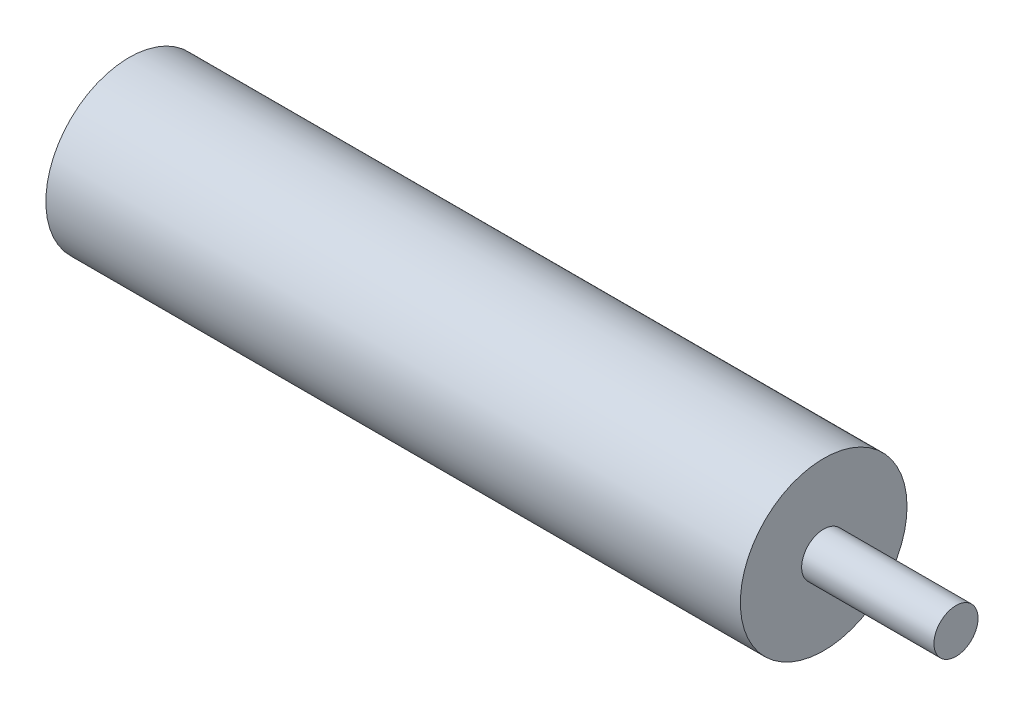
ISO-10303-21;
HEADER;
FILE_DESCRIPTION(('STEP AP214'),'2;1');
FILE_NAME('part.step','',(''),(''),'','','');
FILE_SCHEMA(('AUTOMOTIVE_DESIGN { 1 0 10303 214 1 1 1 1 }'));
ENDSEC;
DATA;
#1=APPLICATION_CONTEXT('core data for automotive mechanical design processes');
#2=APPLICATION_PROTOCOL_DEFINITION('international standard','automotive_design',2000,#1);
#3=PRODUCT_CONTEXT('',#1,'mechanical');
#4=PRODUCT('Part','Part','',(#3));
#5=PRODUCT_RELATED_PRODUCT_CATEGORY('part','',(#4));
#6=PRODUCT_DEFINITION_FORMATION('','',#4);
#7=PRODUCT_DEFINITION_CONTEXT('part definition',#1,'design');
#8=PRODUCT_DEFINITION('design','',#6,#7);
#9=PRODUCT_DEFINITION_SHAPE('','',#8);
#10=(LENGTH_UNIT() NAMED_UNIT(*) SI_UNIT(.MILLI.,.METRE.));
#11=(NAMED_UNIT(*) PLANE_ANGLE_UNIT() SI_UNIT($,.RADIAN.));
#12=(NAMED_UNIT(*) SI_UNIT($,.STERADIAN.) SOLID_ANGLE_UNIT());
#13=UNCERTAINTY_MEASURE_WITH_UNIT(LENGTH_MEASURE(1.E-05),#10,'distance_accuracy_value','');
#14=(GEOMETRIC_REPRESENTATION_CONTEXT(3) GLOBAL_UNCERTAINTY_ASSIGNED_CONTEXT((#13)) GLOBAL_UNIT_ASSIGNED_CONTEXT((#10,
#11,#12)) REPRESENTATION_CONTEXT('',''));
#15=CARTESIAN_POINT('',(0.,0.,0.));
#16=DIRECTION('',(0.,0.,1.));
#17=DIRECTION('',(1.,0.,0.));
#18=AXIS2_PLACEMENT_3D('',#15,#16,#17);
#19=CARTESIAN_POINT('',(50.,0.,0.));
#20=DIRECTION('',(-1.,0.,0.));
#21=DIRECTION('',(0.,0.,1.));
#22=AXIS2_PLACEMENT_3D('',#19,#20,#21);
#23=CYLINDRICAL_SURFACE('',#22,6.);
#24=CARTESIAN_POINT('',(50.,0.,0.));
#25=DIRECTION('',(1.,0.,0.));
#26=DIRECTION('',(0.,0.,-1.));
#27=AXIS2_PLACEMENT_3D('',#24,#25,#26);
#28=CIRCLE('',#27,6.);
#29=CARTESIAN_POINT('',(50.,0.,-6.));
#30=VERTEX_POINT('',#29);
#31=EDGE_CURVE('E37',#30,#30,#28,.T.);
#32=ORIENTED_EDGE('',*,*,#31,.F.);
#33=EDGE_LOOP('',(#32));
#34=FACE_BOUND('',#33,.T.);
#35=CARTESIAN_POINT('',(0.,0.,0.));
#36=DIRECTION('',(1.,0.,0.));
#37=DIRECTION('',(0.,0.,-1.));
#38=AXIS2_PLACEMENT_3D('',#35,#36,#37);
#39=CIRCLE('',#38,6.);
#40=CARTESIAN_POINT('',(0.,0.,-6.));
#41=VERTEX_POINT('',#40);
#42=EDGE_CURVE('E33',#41,#41,#39,.T.);
#43=ORIENTED_EDGE('',*,*,#42,.T.);
#44=EDGE_LOOP('',(#43));
#45=FACE_BOUND('',#44,.T.);
#46=ADVANCED_FACE('F30',(#34,#45),#23,.T.);
#47=CARTESIAN_POINT('',(50.,0.,0.));
#48=DIRECTION('',(1.,0.,0.));
#49=DIRECTION('',(0.,0.,-1.));
#50=AXIS2_PLACEMENT_3D('',#47,#48,#49);
#51=PLANE('',#50);
#52=CARTESIAN_POINT('',(50.,0.,0.));
#53=DIRECTION('',(1.,0.,0.));
#54=DIRECTION('',(0.,0.,-1.));
#55=AXIS2_PLACEMENT_3D('',#52,#53,#54);
#56=CIRCLE('',#55,1.5875);
#57=CARTESIAN_POINT('',(50.,0.,1.5875));
#58=VERTEX_POINT('',#57);
#59=EDGE_CURVE('E10',#58,#58,#56,.T.);
#60=ORIENTED_EDGE('',*,*,#59,.F.);
#61=EDGE_LOOP('',(#60));
#62=FACE_BOUND('',#61,.T.);
#63=ORIENTED_EDGE('',*,*,#31,.T.);
#64=EDGE_LOOP('',(#63));
#65=FACE_BOUND('',#64,.T.);
#66=ADVANCED_FACE('F54',(#62,#65),#51,.T.);
#67=CARTESIAN_POINT('',(0.,0.,0.));
#68=DIRECTION('',(1.,0.,0.));
#69=DIRECTION('',(0.,0.,-1.));
#70=AXIS2_PLACEMENT_3D('',#67,#68,#69);
#71=PLANE('',#70);
#72=ORIENTED_EDGE('',*,*,#42,.F.);
#73=EDGE_LOOP('',(#72));
#74=FACE_BOUND('',#73,.T.);
#75=ADVANCED_FACE('F51',(#74),#71,.F.);
#76=CARTESIAN_POINT('',(59.525,0.,0.));
#77=DIRECTION('',(-1.,0.,0.));
#78=DIRECTION('',(0.,0.,1.));
#79=AXIS2_PLACEMENT_3D('',#76,#77,#78);
#80=CYLINDRICAL_SURFACE('',#79,1.5875);
#81=CARTESIAN_POINT('',(59.525,0.,0.));
#82=DIRECTION('',(1.,0.,0.));
#83=DIRECTION('',(0.,0.,-1.));
#84=AXIS2_PLACEMENT_3D('',#81,#82,#83);
#85=CIRCLE('',#84,1.5875);
#86=CARTESIAN_POINT('',(59.525,0.,1.5875));
#87=VERTEX_POINT('',#86);
#88=EDGE_CURVE('E43',#87,#87,#85,.T.);
#89=CARTESIAN_POINT('',(59.525,0.,1.5875));
#90=CARTESIAN_POINT('',(59.42578125,0.,1.5875));
#91=CARTESIAN_POINT('',(59.3265625,0.,1.5875));
#92=CARTESIAN_POINT('',(59.128125,0.,1.5875));
#93=CARTESIAN_POINT('',(59.02890625,0.,1.5875));
#94=CARTESIAN_POINT('',(58.83046875,0.,1.5875));
#95=CARTESIAN_POINT('',(58.73125,0.,1.5875));
#96=CARTESIAN_POINT('',(58.5328125,0.,1.5875));
#97=CARTESIAN_POINT('',(58.43359375,0.,1.5875));
#98=CARTESIAN_POINT('',(58.23515625,0.,1.5875));
#99=CARTESIAN_POINT('',(58.1359375,0.,1.5875));
#100=CARTESIAN_POINT('',(57.9375,0.,1.5875));
#101=CARTESIAN_POINT('',(57.83828125,0.,1.5875));
#102=CARTESIAN_POINT('',(57.63984375,0.,1.5875));
#103=CARTESIAN_POINT('',(57.540625,0.,1.5875));
#104=CARTESIAN_POINT('',(57.3421875,0.,1.5875));
#105=CARTESIAN_POINT('',(57.24296875,0.,1.5875));
#106=CARTESIAN_POINT('',(57.04453125,0.,1.5875));
#107=CARTESIAN_POINT('',(56.9453125,0.,1.5875));
#108=CARTESIAN_POINT('',(56.746875,0.,1.5875));
#109=CARTESIAN_POINT('',(56.64765625,0.,1.5875));
#110=CARTESIAN_POINT('',(56.44921875,0.,1.5875));
#111=CARTESIAN_POINT('',(56.35,0.,1.5875));
#112=CARTESIAN_POINT('',(56.1515625,0.,1.5875));
#113=CARTESIAN_POINT('',(56.05234375,0.,1.5875));
#114=CARTESIAN_POINT('',(55.85390625,0.,1.5875));
#115=CARTESIAN_POINT('',(55.7546875,0.,1.5875));
#116=CARTESIAN_POINT('',(55.55625,0.,1.5875));
#117=CARTESIAN_POINT('',(55.45703125,0.,1.5875));
#118=CARTESIAN_POINT('',(55.25859375,0.,1.5875));
#119=CARTESIAN_POINT('',(55.159375,0.,1.5875));
#120=CARTESIAN_POINT('',(54.9609375,0.,1.5875));
#121=CARTESIAN_POINT('',(54.86171875,0.,1.5875));
#122=CARTESIAN_POINT('',(54.66328125,0.,1.5875));
#123=CARTESIAN_POINT('',(54.5640625,0.,1.5875));
#124=CARTESIAN_POINT('',(54.365625,0.,1.5875));
#125=CARTESIAN_POINT('',(54.26640625,0.,1.5875));
#126=CARTESIAN_POINT('',(54.06796875,0.,1.5875));
#127=CARTESIAN_POINT('',(53.96875,0.,1.5875));
#128=CARTESIAN_POINT('',(53.7703125,0.,1.5875));
#129=CARTESIAN_POINT('',(53.67109375,0.,1.5875));
#130=CARTESIAN_POINT('',(53.47265625,0.,1.5875));
#131=CARTESIAN_POINT('',(53.3734375,0.,1.5875));
#132=CARTESIAN_POINT('',(53.175,0.,1.5875));
#133=CARTESIAN_POINT('',(53.07578125,0.,1.5875));
#134=CARTESIAN_POINT('',(52.87734375,0.,1.5875));
#135=CARTESIAN_POINT('',(52.778125,0.,1.5875));
#136=CARTESIAN_POINT('',(52.5796875,0.,1.5875));
#137=CARTESIAN_POINT('',(52.48046875,0.,1.5875));
#138=CARTESIAN_POINT('',(52.28203125,0.,1.5875));
#139=CARTESIAN_POINT('',(52.1828125,0.,1.5875));
#140=CARTESIAN_POINT('',(51.984375,0.,1.5875));
#141=CARTESIAN_POINT('',(51.88515625,0.,1.5875));
#142=CARTESIAN_POINT('',(51.68671875,0.,1.5875));
#143=CARTESIAN_POINT('',(51.5875,0.,1.5875));
#144=CARTESIAN_POINT('',(51.3890625,0.,1.5875));
#145=CARTESIAN_POINT('',(51.28984375,0.,1.5875));
#146=CARTESIAN_POINT('',(51.09140625,0.,1.5875));
#147=CARTESIAN_POINT('',(50.9921875,0.,1.5875));
#148=CARTESIAN_POINT('',(50.79375,0.,1.5875));
#149=CARTESIAN_POINT('',(50.69453125,0.,1.5875));
#150=CARTESIAN_POINT('',(50.49609375,0.,1.5875));
#151=CARTESIAN_POINT('',(50.396875,0.,1.5875));
#152=CARTESIAN_POINT('',(50.1984375,0.,1.5875));
#153=CARTESIAN_POINT('',(50.09921875,0.,1.5875));
#154=CARTESIAN_POINT('',(50.,0.,1.5875));
#155=B_SPLINE_CURVE_WITH_KNOTS('',3,(#89,#90,#91,#92,#93,#94,#95,#96,#97,#98,#99,#100,#101,#102,
#103,#104,#105,#106,#107,#108,#109,#110,#111,#112,#113,#114,#115,#116,#117,#118,#119,#120,#121,
#122,#123,#124,#125,#126,#127,#128,#129,#130,#131,#132,#133,#134,#135,#136,#137,#138,#139,#140,
#141,#142,#143,#144,#145,#146,#147,#148,#149,#150,#151,#152,#153,#154),.UNSPECIFIED.,.F.,.F.,(4,
2,2,2,2,2,2,2,2,2,2,2,2,2,2,2,2,2,2,2,2,2,2,2,2,2,2,2,2,2,2,2,4),(0.,0.29765625,0.5953125,
0.892968750000001,1.190625,1.48828125,1.7859375,2.08359375,2.38125,2.67890625,2.9765625,
3.27421875,3.571875,3.86953125,4.1671875,4.46484375,4.7625,5.06015625,5.3578125,5.65546875,
5.953125,6.25078125,6.5484375,6.84609375,7.14375,7.44140625,7.7390625,8.03671875000001,8.334375,
8.63203125,8.92968750000001,9.22734375000001,9.52500000000001),.UNSPECIFIED.);
#156=EDGE_CURVE('BSEAM53',#87,#58,#155,.T.);
#157=ORIENTED_EDGE('',*,*,#88,.F.);
#158=ORIENTED_EDGE('',*,*,#59,.T.);
#159=ORIENTED_EDGE('',*,*,#156,.T.);
#160=ORIENTED_EDGE('',*,*,#156,.F.);
#161=EDGE_LOOP('',(#157,#159,#158,#160));
#162=FACE_BOUND('',#161,.T.);
#163=ADVANCED_FACE('F53',(#162),#80,.T.);
#164=CARTESIAN_POINT('',(59.525,0.,0.));
#165=DIRECTION('',(1.,0.,0.));
#166=DIRECTION('',(0.,0.,-1.));
#167=AXIS2_PLACEMENT_3D('',#164,#165,#166);
#168=PLANE('',#167);
#169=ORIENTED_EDGE('',*,*,#88,.T.);
#170=EDGE_LOOP('',(#169));
#171=FACE_BOUND('',#170,.T.);
#172=ADVANCED_FACE('F59',(#171),#168,.T.);
#173=CLOSED_SHELL('',(#46,#66,#75,#163,#172));
#174=MANIFOLD_SOLID_BREP('B2',#173);
#175=ADVANCED_BREP_SHAPE_REPRESENTATION('',(#18,#174),#14);
#176=SHAPE_DEFINITION_REPRESENTATION(#9,#175);
ENDSEC;
END-ISO-10303-21;
